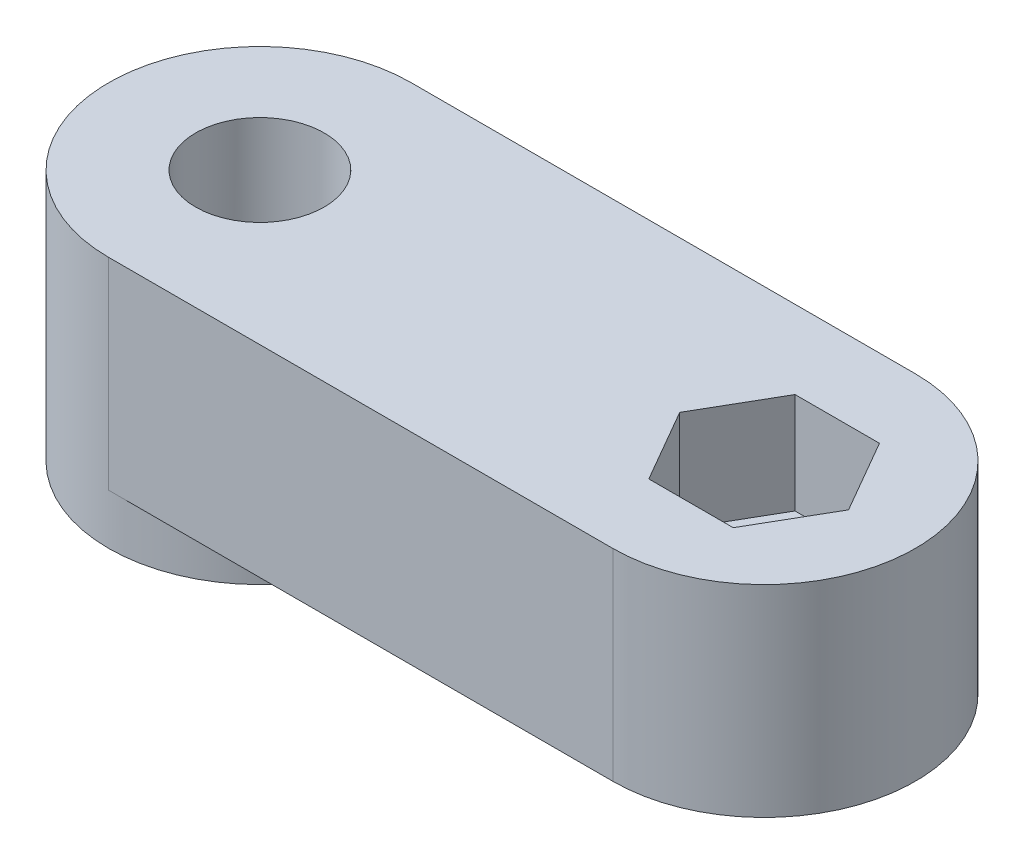
ISO-10303-21;
HEADER;
FILE_DESCRIPTION(('STEP AP214'),'2;1');
FILE_NAME('part.step','',(''),(''),'','','');
FILE_SCHEMA(('AUTOMOTIVE_DESIGN { 1 0 10303 214 1 1 1 1 }'));
ENDSEC;
DATA;
#1=APPLICATION_CONTEXT('core data for automotive mechanical design processes');
#2=APPLICATION_PROTOCOL_DEFINITION('international standard','automotive_design',2000,#1);
#3=PRODUCT_CONTEXT('',#1,'mechanical');
#4=PRODUCT('Part','Part','',(#3));
#5=PRODUCT_RELATED_PRODUCT_CATEGORY('part','',(#4));
#6=PRODUCT_DEFINITION_FORMATION('','',#4);
#7=PRODUCT_DEFINITION_CONTEXT('part definition',#1,'design');
#8=PRODUCT_DEFINITION('design','',#6,#7);
#9=PRODUCT_DEFINITION_SHAPE('','',#8);
#10=(LENGTH_UNIT() NAMED_UNIT(*) SI_UNIT(.MILLI.,.METRE.));
#11=(NAMED_UNIT(*) PLANE_ANGLE_UNIT() SI_UNIT($,.RADIAN.));
#12=(NAMED_UNIT(*) SI_UNIT($,.STERADIAN.) SOLID_ANGLE_UNIT());
#13=UNCERTAINTY_MEASURE_WITH_UNIT(LENGTH_MEASURE(1.E-05),#10,'distance_accuracy_value','');
#14=(GEOMETRIC_REPRESENTATION_CONTEXT(3) GLOBAL_UNCERTAINTY_ASSIGNED_CONTEXT((#13)) GLOBAL_UNIT_ASSIGNED_CONTEXT((#10,
#11,#12)) REPRESENTATION_CONTEXT('',''));
#15=CARTESIAN_POINT('',(0.,0.,0.));
#16=DIRECTION('',(0.,0.,1.));
#17=DIRECTION('',(1.,0.,0.));
#18=AXIS2_PLACEMENT_3D('',#15,#16,#17);
#19=CARTESIAN_POINT('',(20.,10.,0.));
#20=DIRECTION('',(0.,1.,0.));
#21=DIRECTION('',(0.,0.,1.));
#22=AXIS2_PLACEMENT_3D('',#19,#20,#21);
#23=CYLINDRICAL_SURFACE('',#22,2.5);
#24=CARTESIAN_POINT('',(20.,5.,0.));
#25=DIRECTION('',(0.,1.,0.));
#26=DIRECTION('',(0.,0.,1.));
#27=AXIS2_PLACEMENT_3D('',#24,#25,#26);
#28=CIRCLE('',#27,2.5);
#29=CARTESIAN_POINT('',(20.,5.,2.5));
#30=VERTEX_POINT('',#29);
#31=EDGE_CURVE('E267',#30,#30,#28,.T.);
#32=ORIENTED_EDGE('',*,*,#31,.F.);
#33=EDGE_LOOP('',(#32));
#34=FACE_BOUND('',#33,.T.);
#35=CARTESIAN_POINT('',(20.,6.,0.));
#36=DIRECTION('',(0.,1.,0.));
#37=DIRECTION('',(0.,0.,1.));
#38=AXIS2_PLACEMENT_3D('',#35,#36,#37);
#39=CIRCLE('',#38,2.5);
#40=CARTESIAN_POINT('',(20.,6.,2.5));
#41=VERTEX_POINT('',#40);
#42=EDGE_CURVE('E39',#41,#41,#39,.F.);
#43=ORIENTED_EDGE('',*,*,#42,.F.);
#44=EDGE_LOOP('',(#43));
#45=FACE_BOUND('',#44,.T.);
#46=ADVANCED_FACE('F35',(#34,#45),#23,.F.);
#47=CARTESIAN_POINT('',(0.,10.,6.));
#48=DIRECTION('',(0.,0.,-1.));
#49=DIRECTION('',(-1.,0.,0.));
#50=AXIS2_PLACEMENT_3D('',#47,#48,#49);
#51=PLANE('',#50);
#52=DIRECTION('',(-1.,0.,0.));
#53=VECTOR('',#52,1.);
#54=CARTESIAN_POINT('',(0.,2.,6.));
#55=LINE('',#54,#53);
#56=CARTESIAN_POINT('',(20.,2.,6.));
#57=VERTEX_POINT('',#56);
#58=CARTESIAN_POINT('',(0.,2.,6.));
#59=VERTEX_POINT('',#58);
#60=EDGE_CURVE('E213',#57,#59,#55,.T.);
#61=ORIENTED_EDGE('',*,*,#60,.F.);
#62=DIRECTION('',(0.,-1.,0.));
#63=VECTOR('',#62,1.);
#64=CARTESIAN_POINT('',(20.,10.,6.));
#65=LINE('',#64,#63);
#66=CARTESIAN_POINT('',(20.,10.,6.));
#67=VERTEX_POINT('',#66);
#68=EDGE_CURVE('E44',#67,#57,#65,.T.);
#69=ORIENTED_EDGE('',*,*,#68,.F.);
#70=DIRECTION('',(1.,0.,0.));
#71=VECTOR('',#70,1.);
#72=CARTESIAN_POINT('',(0.,10.,6.));
#73=LINE('',#72,#71);
#74=CARTESIAN_POINT('',(0.,10.,6.));
#75=VERTEX_POINT('',#74);
#76=EDGE_CURVE('E277',#75,#67,#73,.T.);
#77=ORIENTED_EDGE('',*,*,#76,.F.);
#78=DIRECTION('',(0.,-1.,0.));
#79=VECTOR('',#78,1.);
#80=CARTESIAN_POINT('',(0.,10.,6.));
#81=LINE('',#80,#79);
#82=EDGE_CURVE('E11',#75,#59,#81,.T.);
#83=ORIENTED_EDGE('',*,*,#82,.T.);
#84=EDGE_LOOP('',(#61,#69,#77,#83));
#85=FACE_BOUND('',#84,.T.);
#86=ADVANCED_FACE('F315',(#85),#51,.F.);
#87=CARTESIAN_POINT('',(20.,10.,0.));
#88=DIRECTION('',(0.,-1.,0.));
#89=DIRECTION('',(0.,0.,-1.));
#90=AXIS2_PLACEMENT_3D('',#87,#88,#89);
#91=CYLINDRICAL_SURFACE('',#90,6.);
#92=CARTESIAN_POINT('',(20.,2.,0.));
#93=DIRECTION('',(0.,-1.,0.));
#94=DIRECTION('',(0.,0.,-1.));
#95=AXIS2_PLACEMENT_3D('',#92,#93,#94);
#96=CIRCLE('',#95,6.);
#97=CARTESIAN_POINT('',(20.,2.,-6.));
#98=VERTEX_POINT('',#97);
#99=EDGE_CURVE('E211',#98,#57,#96,.T.);
#100=ORIENTED_EDGE('',*,*,#99,.F.);
#101=DIRECTION('',(0.,-1.,0.));
#102=VECTOR('',#101,1.);
#103=CARTESIAN_POINT('',(20.,10.,-6.));
#104=LINE('',#103,#102);
#105=CARTESIAN_POINT('',(20.,10.,-6.));
#106=VERTEX_POINT('',#105);
#107=EDGE_CURVE('E288',#106,#98,#104,.T.);
#108=ORIENTED_EDGE('',*,*,#107,.F.);
#109=CARTESIAN_POINT('',(20.,10.,0.));
#110=DIRECTION('',(0.,1.,0.));
#111=DIRECTION('',(0.,0.,1.));
#112=AXIS2_PLACEMENT_3D('',#109,#110,#111);
#113=CIRCLE('',#112,6.);
#114=EDGE_CURVE('E279',#67,#106,#113,.T.);
#115=ORIENTED_EDGE('',*,*,#114,.F.);
#116=ORIENTED_EDGE('',*,*,#68,.T.);
#117=EDGE_LOOP('',(#100,#108,#115,#116));
#118=FACE_BOUND('',#117,.T.);
#119=ADVANCED_FACE('F323',(#118),#91,.T.);
#120=CARTESIAN_POINT('',(0.,10.,-6.));
#121=DIRECTION('',(0.,0.,1.));
#122=DIRECTION('',(1.,0.,0.));
#123=AXIS2_PLACEMENT_3D('',#120,#121,#122);
#124=PLANE('',#123);
#125=DIRECTION('',(1.,0.,0.));
#126=VECTOR('',#125,1.);
#127=CARTESIAN_POINT('',(0.,2.,-6.));
#128=LINE('',#127,#126);
#129=CARTESIAN_POINT('',(0.,2.,-6.));
#130=VERTEX_POINT('',#129);
#131=EDGE_CURVE('E209',#130,#98,#128,.T.);
#132=ORIENTED_EDGE('',*,*,#131,.F.);
#133=DIRECTION('',(0.,-1.,0.));
#134=VECTOR('',#133,1.);
#135=CARTESIAN_POINT('',(0.,10.,-6.));
#136=LINE('',#135,#134);
#137=CARTESIAN_POINT('',(0.,10.,-6.));
#138=VERTEX_POINT('',#137);
#139=EDGE_CURVE('E283',#138,#130,#136,.T.);
#140=ORIENTED_EDGE('',*,*,#139,.F.);
#141=DIRECTION('',(-1.,0.,0.));
#142=VECTOR('',#141,1.);
#143=CARTESIAN_POINT('',(0.,10.,-6.));
#144=LINE('',#143,#142);
#145=EDGE_CURVE('E281',#106,#138,#144,.T.);
#146=ORIENTED_EDGE('',*,*,#145,.F.);
#147=ORIENTED_EDGE('',*,*,#107,.T.);
#148=EDGE_LOOP('',(#132,#140,#146,#147));
#149=FACE_BOUND('',#148,.T.);
#150=ADVANCED_FACE('F309',(#149),#124,.F.);
#151=CARTESIAN_POINT('',(0.,0.,0.));
#152=DIRECTION('',(0.,1.,0.));
#153=DIRECTION('',(0.,0.,1.));
#154=AXIS2_PLACEMENT_3D('',#151,#152,#153);
#155=PLANE('',#154);
#156=DIRECTION('',(0.5,0.,-0.866025403784439));
#157=VECTOR('',#156,1.);
#158=CARTESIAN_POINT('',(-4.21465696508427,0.,0.));
#159=LINE('',#158,#157);
#160=CARTESIAN_POINT('',(-4.21465696508427,0.,0.));
#161=VERTEX_POINT('',#160);
#162=CARTESIAN_POINT('',(-2.10732848254214,0.,-3.65));
#163=VERTEX_POINT('',#162);
#164=EDGE_CURVE('E236',#161,#163,#159,.T.);
#165=ORIENTED_EDGE('',*,*,#164,.F.);
#166=DIRECTION('',(-0.5,0.,-0.866025403784438));
#167=VECTOR('',#166,1.);
#168=CARTESIAN_POINT('',(-2.10732848254213,0.,3.65));
#169=LINE('',#168,#167);
#170=CARTESIAN_POINT('',(-2.10732848254213,0.,3.65));
#171=VERTEX_POINT('',#170);
#172=EDGE_CURVE('E60',#171,#161,#169,.T.);
#173=ORIENTED_EDGE('',*,*,#172,.F.);
#174=DIRECTION('',(-1.,0.,0.));
#175=VECTOR('',#174,1.);
#176=CARTESIAN_POINT('',(2.10732848254214,0.,3.65));
#177=LINE('',#176,#175);
#178=CARTESIAN_POINT('',(2.10732848254214,0.,3.65));
#179=VERTEX_POINT('',#178);
#180=EDGE_CURVE('E219',#179,#171,#177,.T.);
#181=ORIENTED_EDGE('',*,*,#180,.F.);
#182=DIRECTION('',(-0.5,0.,0.866025403784439));
#183=VECTOR('',#182,1.);
#184=CARTESIAN_POINT('',(4.21465696508427,0.,0.));
#185=LINE('',#184,#183);
#186=CARTESIAN_POINT('',(4.21465696508427,0.,0.));
#187=VERTEX_POINT('',#186);
#188=EDGE_CURVE('E245',#187,#179,#185,.T.);
#189=ORIENTED_EDGE('',*,*,#188,.F.);
#190=DIRECTION('',(0.5,0.,0.866025403784439));
#191=VECTOR('',#190,1.);
#192=CARTESIAN_POINT('',(2.10732848254213,0.,-3.65));
#193=LINE('',#192,#191);
#194=CARTESIAN_POINT('',(2.10732848254213,0.,-3.65));
#195=VERTEX_POINT('',#194);
#196=EDGE_CURVE('E242',#195,#187,#193,.T.);
#197=ORIENTED_EDGE('',*,*,#196,.F.);
#198=DIRECTION('',(1.,0.,0.));
#199=VECTOR('',#198,1.);
#200=CARTESIAN_POINT('',(-2.10732848254214,0.,-3.65));
#201=LINE('',#200,#199);
#202=EDGE_CURVE('E239',#163,#195,#201,.T.);
#203=ORIENTED_EDGE('',*,*,#202,.F.);
#204=EDGE_LOOP('',(#165,#173,#181,#189,#197,#203));
#205=FACE_BOUND('',#204,.T.);
#206=CARTESIAN_POINT('',(0.,0.,0.));
#207=DIRECTION('',(0.,1.,0.));
#208=DIRECTION('',(0.,0.,1.));
#209=AXIS2_PLACEMENT_3D('',#206,#207,#208);
#210=CIRCLE('',#209,6.);
#211=CARTESIAN_POINT('',(0.,0.,6.));
#212=VERTEX_POINT('',#211);
#213=EDGE_CURVE('E273',#212,#212,#210,.T.);
#214=ORIENTED_EDGE('',*,*,#213,.F.);
#215=EDGE_LOOP('',(#214));
#216=FACE_BOUND('',#215,.T.);
#217=ADVANCED_FACE('F300',(#205,#216),#155,.F.);
#218=CARTESIAN_POINT('',(20.,10.,0.));
#219=DIRECTION('',(0.,1.,0.));
#220=DIRECTION('',(0.,0.,1.));
#221=AXIS2_PLACEMENT_3D('',#218,#219,#220);
#222=CYLINDRICAL_SURFACE('',#221,2.075);
#223=CARTESIAN_POINT('',(20.,5.,0.));
#224=DIRECTION('',(0.,1.,0.));
#225=DIRECTION('',(0.,0.,1.));
#226=AXIS2_PLACEMENT_3D('',#223,#224,#225);
#227=CIRCLE('',#226,2.075);
#228=CARTESIAN_POINT('',(20.,5.,2.075));
#229=VERTEX_POINT('',#228);
#230=EDGE_CURVE('E264',#229,#229,#227,.T.);
#231=ORIENTED_EDGE('',*,*,#230,.T.);
#232=EDGE_LOOP('',(#231));
#233=FACE_BOUND('',#232,.T.);
#234=CARTESIAN_POINT('',(20.,2.,0.));
#235=DIRECTION('',(0.,-1.,0.));
#236=DIRECTION('',(0.,0.,-1.));
#237=AXIS2_PLACEMENT_3D('',#234,#235,#236);
#238=CIRCLE('',#237,2.075);
#239=CARTESIAN_POINT('',(20.,2.,-2.075));
#240=VERTEX_POINT('',#239);
#241=EDGE_CURVE('E208',#240,#240,#238,.F.);
#242=ORIENTED_EDGE('',*,*,#241,.F.);
#243=EDGE_LOOP('',(#242));
#244=FACE_BOUND('',#243,.T.);
#245=ADVANCED_FACE('F298',(#233,#244),#222,.F.);
#246=CARTESIAN_POINT('',(0.,10.,0.));
#247=DIRECTION('',(0.,-1.,0.));
#248=DIRECTION('',(0.,0.,-1.));
#249=AXIS2_PLACEMENT_3D('',#246,#247,#248);
#250=CYLINDRICAL_SURFACE('',#249,6.);
#251=ORIENTED_EDGE('',*,*,#213,.T.);
#252=EDGE_LOOP('',(#251));
#253=FACE_BOUND('',#252,.T.);
#254=CARTESIAN_POINT('',(0.,2.,0.));
#255=DIRECTION('',(0.,-1.,0.));
#256=DIRECTION('',(0.,0.,-1.));
#257=AXIS2_PLACEMENT_3D('',#254,#255,#256);
#258=CIRCLE('',#257,6.);
#259=EDGE_CURVE('E205',#130,#59,#258,.T.);
#260=ORIENTED_EDGE('',*,*,#259,.T.);
#261=ORIENTED_EDGE('',*,*,#82,.F.);
#262=CARTESIAN_POINT('',(0.,10.,0.));
#263=DIRECTION('',(0.,1.,0.));
#264=DIRECTION('',(0.,0.,1.));
#265=AXIS2_PLACEMENT_3D('',#262,#263,#264);
#266=CIRCLE('',#265,6.);
#267=EDGE_CURVE('E274',#138,#75,#266,.T.);
#268=ORIENTED_EDGE('',*,*,#267,.F.);
#269=ORIENTED_EDGE('',*,*,#139,.T.);
#270=EDGE_LOOP('',(#260,#261,#268,#269));
#271=FACE_BOUND('',#270,.T.);
#272=ADVANCED_FACE('F37',(#253,#271),#250,.T.);
#273=CARTESIAN_POINT('',(0.,10.,0.));
#274=DIRECTION('',(0.,1.,0.));
#275=DIRECTION('',(0.,0.,1.));
#276=AXIS2_PLACEMENT_3D('',#273,#274,#275);
#277=PLANE('',#276);
#278=DIRECTION('',(-1.,0.,0.));
#279=VECTOR('',#278,1.);
#280=CARTESIAN_POINT('',(21.6743157806499,10.,-2.89999999999999));
#281=LINE('',#280,#279);
#282=CARTESIAN_POINT('',(21.6743157806499,10.,-2.89999999999999));
#283=VERTEX_POINT('',#282);
#284=CARTESIAN_POINT('',(18.3256842193501,10.,-2.89999999999999));
#285=VERTEX_POINT('',#284);
#286=EDGE_CURVE('E52',#283,#285,#281,.T.);
#287=ORIENTED_EDGE('',*,*,#286,.F.);
#288=DIRECTION('',(-0.5,0.,-0.866025403784439));
#289=VECTOR('',#288,1.);
#290=CARTESIAN_POINT('',(23.3486315612998,10.,0.));
#291=LINE('',#290,#289);
#292=CARTESIAN_POINT('',(23.3486315612998,10.,0.));
#293=VERTEX_POINT('',#292);
#294=EDGE_CURVE('E172',#293,#283,#291,.T.);
#295=ORIENTED_EDGE('',*,*,#294,.F.);
#296=DIRECTION('',(0.5,0.,-0.866025403784439));
#297=VECTOR('',#296,1.);
#298=CARTESIAN_POINT('',(21.6743157806499,10.,2.90000000000001));
#299=LINE('',#298,#297);
#300=CARTESIAN_POINT('',(21.6743157806499,10.,2.90000000000001));
#301=VERTEX_POINT('',#300);
#302=EDGE_CURVE('E175',#301,#293,#299,.T.);
#303=ORIENTED_EDGE('',*,*,#302,.F.);
#304=DIRECTION('',(1.,0.,0.));
#305=VECTOR('',#304,1.);
#306=CARTESIAN_POINT('',(18.3256842193501,10.,2.90000000000001));
#307=LINE('',#306,#305);
#308=CARTESIAN_POINT('',(18.3256842193501,10.,2.90000000000001));
#309=VERTEX_POINT('',#308);
#310=EDGE_CURVE('E191',#309,#301,#307,.T.);
#311=ORIENTED_EDGE('',*,*,#310,.F.);
#312=DIRECTION('',(0.5,0.,0.866025403784438));
#313=VECTOR('',#312,1.);
#314=CARTESIAN_POINT('',(16.6513684387002,10.,0.));
#315=LINE('',#314,#313);
#316=CARTESIAN_POINT('',(16.6513684387002,10.,0.));
#317=VERTEX_POINT('',#316);
#318=EDGE_CURVE('E188',#317,#309,#315,.T.);
#319=ORIENTED_EDGE('',*,*,#318,.F.);
#320=DIRECTION('',(-0.5,0.,0.866025403784439));
#321=VECTOR('',#320,1.);
#322=CARTESIAN_POINT('',(18.3256842193501,10.,-2.89999999999999));
#323=LINE('',#322,#321);
#324=EDGE_CURVE('E186',#285,#317,#323,.T.);
#325=ORIENTED_EDGE('',*,*,#324,.F.);
#326=EDGE_LOOP('',(#287,#295,#303,#311,#319,#325));
#327=FACE_BOUND('',#326,.T.);
#328=CARTESIAN_POINT('',(0.,10.,0.));
#329=DIRECTION('',(0.,1.,0.));
#330=DIRECTION('',(0.,0.,1.));
#331=AXIS2_PLACEMENT_3D('',#328,#329,#330);
#332=CIRCLE('',#331,2.55);
#333=CARTESIAN_POINT('',(0.,10.,2.55));
#334=VERTEX_POINT('',#333);
#335=EDGE_CURVE('E270',#334,#334,#332,.T.);
#336=ORIENTED_EDGE('',*,*,#335,.F.);
#337=EDGE_LOOP('',(#336));
#338=FACE_BOUND('',#337,.T.);
#339=ORIENTED_EDGE('',*,*,#267,.T.);
#340=ORIENTED_EDGE('',*,*,#76,.T.);
#341=ORIENTED_EDGE('',*,*,#114,.T.);
#342=ORIENTED_EDGE('',*,*,#145,.T.);
#343=EDGE_LOOP('',(#339,#340,#341,#342));
#344=FACE_BOUND('',#343,.T.);
#345=ADVANCED_FACE('F307',(#327,#338,#344),#277,.T.);
#346=CARTESIAN_POINT('',(0.,10.,0.));
#347=DIRECTION('',(0.,1.,0.));
#348=DIRECTION('',(0.,0.,1.));
#349=AXIS2_PLACEMENT_3D('',#346,#347,#348);
#350=CYLINDRICAL_SURFACE('',#349,2.55);
#351=CARTESIAN_POINT('',(0.,5.,0.));
#352=DIRECTION('',(0.,-1.,0.));
#353=DIRECTION('',(0.,0.,-1.));
#354=AXIS2_PLACEMENT_3D('',#351,#352,#353);
#355=CIRCLE('',#354,2.55);
#356=CARTESIAN_POINT('',(0.,5.,-2.55));
#357=VERTEX_POINT('',#356);
#358=EDGE_CURVE('E252',#357,#357,#355,.F.);
#359=ORIENTED_EDGE('',*,*,#358,.F.);
#360=EDGE_LOOP('',(#359));
#361=FACE_BOUND('',#360,.T.);
#362=ORIENTED_EDGE('',*,*,#335,.T.);
#363=EDGE_LOOP('',(#362));
#364=FACE_BOUND('',#363,.T.);
#365=ADVANCED_FACE('F329',(#361,#364),#350,.F.);
#366=CARTESIAN_POINT('',(17.5,5.,0.));
#367=DIRECTION('',(0.,-1.,0.));
#368=DIRECTION('',(0.,0.,-1.));
#369=AXIS2_PLACEMENT_3D('',#366,#367,#368);
#370=PLANE('',#369);
#371=ORIENTED_EDGE('',*,*,#230,.F.);
#372=EDGE_LOOP('',(#371));
#373=FACE_BOUND('',#372,.T.);
#374=ORIENTED_EDGE('',*,*,#31,.T.);
#375=EDGE_LOOP('',(#374));
#376=FACE_BOUND('',#375,.T.);
#377=ADVANCED_FACE('F328',(#373,#376),#370,.F.);
#378=CARTESIAN_POINT('',(0.,5.,0.));
#379=DIRECTION('',(0.,-1.,0.));
#380=DIRECTION('',(0.,0.,-1.));
#381=AXIS2_PLACEMENT_3D('',#378,#379,#380);
#382=PLANE('',#381);
#383=DIRECTION('',(-0.5,0.,-0.866025403784438));
#384=VECTOR('',#383,1.);
#385=CARTESIAN_POINT('',(-2.10732848254213,5.,3.65));
#386=LINE('',#385,#384);
#387=CARTESIAN_POINT('',(-2.10732848254213,5.,3.65));
#388=VERTEX_POINT('',#387);
#389=CARTESIAN_POINT('',(-4.21465696508427,5.,0.));
#390=VERTEX_POINT('',#389);
#391=EDGE_CURVE('E215',#388,#390,#386,.T.);
#392=ORIENTED_EDGE('',*,*,#391,.T.);
#393=DIRECTION('',(0.5,0.,-0.866025403784439));
#394=VECTOR('',#393,1.);
#395=CARTESIAN_POINT('',(-4.21465696508427,5.,0.));
#396=LINE('',#395,#394);
#397=CARTESIAN_POINT('',(-2.10732848254214,5.,-3.65));
#398=VERTEX_POINT('',#397);
#399=EDGE_CURVE('E218',#390,#398,#396,.T.);
#400=ORIENTED_EDGE('',*,*,#399,.T.);
#401=DIRECTION('',(1.,0.,0.));
#402=VECTOR('',#401,1.);
#403=CARTESIAN_POINT('',(-2.10732848254214,5.,-3.65));
#404=LINE('',#403,#402);
#405=CARTESIAN_POINT('',(2.10732848254213,5.,-3.65));
#406=VERTEX_POINT('',#405);
#407=EDGE_CURVE('E222',#398,#406,#404,.T.);
#408=ORIENTED_EDGE('',*,*,#407,.T.);
#409=DIRECTION('',(0.5,0.,0.866025403784439));
#410=VECTOR('',#409,1.);
#411=CARTESIAN_POINT('',(2.10732848254213,5.,-3.65));
#412=LINE('',#411,#410);
#413=CARTESIAN_POINT('',(4.21465696508427,5.,0.));
#414=VERTEX_POINT('',#413);
#415=EDGE_CURVE('E225',#406,#414,#412,.T.);
#416=ORIENTED_EDGE('',*,*,#415,.T.);
#417=DIRECTION('',(-0.5,0.,0.866025403784439));
#418=VECTOR('',#417,1.);
#419=CARTESIAN_POINT('',(4.21465696508427,5.,0.));
#420=LINE('',#419,#418);
#421=CARTESIAN_POINT('',(2.10732848254214,5.,3.65));
#422=VERTEX_POINT('',#421);
#423=EDGE_CURVE('E228',#414,#422,#420,.T.);
#424=ORIENTED_EDGE('',*,*,#423,.T.);
#425=DIRECTION('',(-1.,0.,0.));
#426=VECTOR('',#425,1.);
#427=CARTESIAN_POINT('',(2.10732848254214,5.,3.65));
#428=LINE('',#427,#426);
#429=EDGE_CURVE('E231',#422,#388,#428,.T.);
#430=ORIENTED_EDGE('',*,*,#429,.T.);
#431=EDGE_LOOP('',(#392,#400,#408,#416,#424,#430));
#432=FACE_BOUND('',#431,.T.);
#433=ORIENTED_EDGE('',*,*,#358,.T.);
#434=EDGE_LOOP('',(#433));
#435=FACE_BOUND('',#434,.T.);
#436=ADVANCED_FACE('F368',(#432,#435),#382,.T.);
#437=CARTESIAN_POINT('',(-2.10732848254213,5.,3.65));
#438=DIRECTION('',(-0.866025403784438,0.,0.5));
#439=DIRECTION('',(0.5,0.,0.866025403784439));
#440=AXIS2_PLACEMENT_3D('',#437,#438,#439);
#441=PLANE('',#440);
#442=ORIENTED_EDGE('',*,*,#172,.T.);
#443=DIRECTION('',(0.,-1.,0.));
#444=VECTOR('',#443,1.);
#445=CARTESIAN_POINT('',(-4.21465696508427,5.,0.));
#446=LINE('',#445,#444);
#447=EDGE_CURVE('E234',#390,#161,#446,.T.);
#448=ORIENTED_EDGE('',*,*,#447,.F.);
#449=ORIENTED_EDGE('',*,*,#391,.F.);
#450=DIRECTION('',(0.,-1.,0.));
#451=VECTOR('',#450,1.);
#452=CARTESIAN_POINT('',(-2.10732848254213,5.,3.65));
#453=LINE('',#452,#451);
#454=EDGE_CURVE('E250',#388,#171,#453,.T.);
#455=ORIENTED_EDGE('',*,*,#454,.T.);
#456=EDGE_LOOP('',(#442,#448,#449,#455));
#457=FACE_BOUND('',#456,.T.);
#458=ADVANCED_FACE('F371',(#457),#441,.F.);
#459=CARTESIAN_POINT('',(2.10732848254214,5.,3.65));
#460=DIRECTION('',(0.,0.,1.));
#461=DIRECTION('',(1.,0.,0.));
#462=AXIS2_PLACEMENT_3D('',#459,#460,#461);
#463=PLANE('',#462);
#464=ORIENTED_EDGE('',*,*,#180,.T.);
#465=ORIENTED_EDGE('',*,*,#454,.F.);
#466=ORIENTED_EDGE('',*,*,#429,.F.);
#467=DIRECTION('',(0.,-1.,0.));
#468=VECTOR('',#467,1.);
#469=CARTESIAN_POINT('',(2.10732848254214,5.,3.65));
#470=LINE('',#469,#468);
#471=EDGE_CURVE('E253',#422,#179,#470,.T.);
#472=ORIENTED_EDGE('',*,*,#471,.T.);
#473=EDGE_LOOP('',(#464,#465,#466,#472));
#474=FACE_BOUND('',#473,.T.);
#475=ADVANCED_FACE('F373',(#474),#463,.F.);
#476=CARTESIAN_POINT('',(4.21465696508427,5.,0.));
#477=DIRECTION('',(0.866025403784439,0.,0.5));
#478=DIRECTION('',(0.5,0.,-0.866025403784439));
#479=AXIS2_PLACEMENT_3D('',#476,#477,#478);
#480=PLANE('',#479);
#481=ORIENTED_EDGE('',*,*,#188,.T.);
#482=ORIENTED_EDGE('',*,*,#471,.F.);
#483=ORIENTED_EDGE('',*,*,#423,.F.);
#484=DIRECTION('',(0.,-1.,0.));
#485=VECTOR('',#484,1.);
#486=CARTESIAN_POINT('',(4.21465696508427,5.,0.));
#487=LINE('',#486,#485);
#488=EDGE_CURVE('E255',#414,#187,#487,.T.);
#489=ORIENTED_EDGE('',*,*,#488,.T.);
#490=EDGE_LOOP('',(#481,#482,#483,#489));
#491=FACE_BOUND('',#490,.T.);
#492=ADVANCED_FACE('F376',(#491),#480,.F.);
#493=CARTESIAN_POINT('',(2.10732848254213,5.,-3.65));
#494=DIRECTION('',(0.866025403784439,0.,-0.5));
#495=DIRECTION('',(-0.5,0.,-0.866025403784439));
#496=AXIS2_PLACEMENT_3D('',#493,#494,#495);
#497=PLANE('',#496);
#498=ORIENTED_EDGE('',*,*,#196,.T.);
#499=ORIENTED_EDGE('',*,*,#488,.F.);
#500=ORIENTED_EDGE('',*,*,#415,.F.);
#501=DIRECTION('',(0.,-1.,0.));
#502=VECTOR('',#501,1.);
#503=CARTESIAN_POINT('',(2.10732848254213,5.,-3.65));
#504=LINE('',#503,#502);
#505=EDGE_CURVE('E257',#406,#195,#504,.T.);
#506=ORIENTED_EDGE('',*,*,#505,.T.);
#507=EDGE_LOOP('',(#498,#499,#500,#506));
#508=FACE_BOUND('',#507,.T.);
#509=ADVANCED_FACE('F380',(#508),#497,.F.);
#510=CARTESIAN_POINT('',(-2.10732848254214,5.,-3.65));
#511=DIRECTION('',(0.,0.,-1.));
#512=DIRECTION('',(-1.,0.,0.));
#513=AXIS2_PLACEMENT_3D('',#510,#511,#512);
#514=PLANE('',#513);
#515=ORIENTED_EDGE('',*,*,#202,.T.);
#516=ORIENTED_EDGE('',*,*,#505,.F.);
#517=ORIENTED_EDGE('',*,*,#407,.F.);
#518=DIRECTION('',(0.,-1.,0.));
#519=VECTOR('',#518,1.);
#520=CARTESIAN_POINT('',(-2.10732848254214,5.,-3.65));
#521=LINE('',#520,#519);
#522=EDGE_CURVE('E259',#398,#163,#521,.T.);
#523=ORIENTED_EDGE('',*,*,#522,.T.);
#524=EDGE_LOOP('',(#515,#516,#517,#523));
#525=FACE_BOUND('',#524,.T.);
#526=ADVANCED_FACE('F362',(#525),#514,.F.);
#527=CARTESIAN_POINT('',(-4.21465696508427,5.,0.));
#528=DIRECTION('',(-0.866025403784439,0.,-0.5));
#529=DIRECTION('',(-0.5,0.,0.866025403784439));
#530=AXIS2_PLACEMENT_3D('',#527,#528,#529);
#531=PLANE('',#530);
#532=ORIENTED_EDGE('',*,*,#164,.T.);
#533=ORIENTED_EDGE('',*,*,#522,.F.);
#534=ORIENTED_EDGE('',*,*,#399,.F.);
#535=ORIENTED_EDGE('',*,*,#447,.T.);
#536=EDGE_LOOP('',(#532,#533,#534,#535));
#537=FACE_BOUND('',#536,.T.);
#538=ADVANCED_FACE('F355',(#537),#531,.F.);
#539=CARTESIAN_POINT('',(0.,2.,0.));
#540=DIRECTION('',(0.,-1.,0.));
#541=DIRECTION('',(0.,0.,-1.));
#542=AXIS2_PLACEMENT_3D('',#539,#540,#541);
#543=PLANE('',#542);
#544=ORIENTED_EDGE('',*,*,#241,.T.);
#545=EDGE_LOOP('',(#544));
#546=FACE_BOUND('',#545,.T.);
#547=ORIENTED_EDGE('',*,*,#60,.T.);
#548=ORIENTED_EDGE('',*,*,#259,.F.);
#549=ORIENTED_EDGE('',*,*,#131,.T.);
#550=ORIENTED_EDGE('',*,*,#99,.T.);
#551=EDGE_LOOP('',(#547,#548,#549,#550));
#552=FACE_BOUND('',#551,.T.);
#553=ADVANCED_FACE('F295',(#546,#552),#543,.T.);
#554=CARTESIAN_POINT('',(0.,6.,0.));
#555=DIRECTION('',(0.,1.,0.));
#556=DIRECTION('',(0.,0.,1.));
#557=AXIS2_PLACEMENT_3D('',#554,#555,#556);
#558=PLANE('',#557);
#559=DIRECTION('',(-1.,0.,0.));
#560=VECTOR('',#559,1.);
#561=CARTESIAN_POINT('',(21.6743157806499,6.,-2.89999999999999));
#562=LINE('',#561,#560);
#563=CARTESIAN_POINT('',(21.6743157806499,6.,-2.89999999999999));
#564=VERTEX_POINT('',#563);
#565=CARTESIAN_POINT('',(18.3256842193501,6.,-2.89999999999999));
#566=VERTEX_POINT('',#565);
#567=EDGE_CURVE('E152',#564,#566,#562,.T.);
#568=ORIENTED_EDGE('',*,*,#567,.T.);
#569=DIRECTION('',(-0.5,0.,0.866025403784439));
#570=VECTOR('',#569,1.);
#571=CARTESIAN_POINT('',(18.3256842193501,6.,-2.89999999999999));
#572=LINE('',#571,#570);
#573=CARTESIAN_POINT('',(16.6513684387002,6.,0.));
#574=VERTEX_POINT('',#573);
#575=EDGE_CURVE('E161',#566,#574,#572,.T.);
#576=ORIENTED_EDGE('',*,*,#575,.T.);
#577=DIRECTION('',(0.5,0.,0.866025403784438));
#578=VECTOR('',#577,1.);
#579=CARTESIAN_POINT('',(16.6513684387002,6.,0.));
#580=LINE('',#579,#578);
#581=CARTESIAN_POINT('',(18.3256842193501,6.,2.90000000000001));
#582=VERTEX_POINT('',#581);
#583=EDGE_CURVE('E166',#574,#582,#580,.T.);
#584=ORIENTED_EDGE('',*,*,#583,.T.);
#585=DIRECTION('',(1.,0.,0.));
#586=VECTOR('',#585,1.);
#587=CARTESIAN_POINT('',(18.3256842193501,6.,2.90000000000001));
#588=LINE('',#587,#586);
#589=CARTESIAN_POINT('',(21.6743157806499,6.,2.90000000000001));
#590=VERTEX_POINT('',#589);
#591=EDGE_CURVE('E179',#582,#590,#588,.T.);
#592=ORIENTED_EDGE('',*,*,#591,.T.);
#593=DIRECTION('',(0.5,0.,-0.866025403784439));
#594=VECTOR('',#593,1.);
#595=CARTESIAN_POINT('',(21.6743157806499,6.,2.90000000000001));
#596=LINE('',#595,#594);
#597=CARTESIAN_POINT('',(23.3486315612998,6.,0.));
#598=VERTEX_POINT('',#597);
#599=EDGE_CURVE('E182',#590,#598,#596,.T.);
#600=ORIENTED_EDGE('',*,*,#599,.T.);
#601=DIRECTION('',(-0.5,0.,-0.866025403784439));
#602=VECTOR('',#601,1.);
#603=CARTESIAN_POINT('',(23.3486315612998,6.,0.));
#604=LINE('',#603,#602);
#605=EDGE_CURVE('E158',#598,#564,#604,.T.);
#606=ORIENTED_EDGE('',*,*,#605,.T.);
#607=EDGE_LOOP('',(#568,#576,#584,#592,#600,#606));
#608=FACE_BOUND('',#607,.T.);
#609=ORIENTED_EDGE('',*,*,#42,.T.);
#610=EDGE_LOOP('',(#609));
#611=FACE_BOUND('',#610,.T.);
#612=ADVANCED_FACE('F168',(#608,#611),#558,.T.);
#613=CARTESIAN_POINT('',(21.6743157806499,6.,-2.89999999999999));
#614=DIRECTION('',(0.,0.,-1.));
#615=DIRECTION('',(-1.,0.,0.));
#616=AXIS2_PLACEMENT_3D('',#613,#614,#615);
#617=PLANE('',#616);
#618=ORIENTED_EDGE('',*,*,#286,.T.);
#619=DIRECTION('',(0.,1.,0.));
#620=VECTOR('',#619,1.);
#621=CARTESIAN_POINT('',(18.3256842193501,6.,-2.89999999999999));
#622=LINE('',#621,#620);
#623=EDGE_CURVE('E148',#566,#285,#622,.T.);
#624=ORIENTED_EDGE('',*,*,#623,.F.);
#625=ORIENTED_EDGE('',*,*,#567,.F.);
#626=DIRECTION('',(0.,1.,0.));
#627=VECTOR('',#626,1.);
#628=CARTESIAN_POINT('',(21.6743157806499,6.,-2.89999999999999));
#629=LINE('',#628,#627);
#630=EDGE_CURVE('E196',#564,#283,#629,.T.);
#631=ORIENTED_EDGE('',*,*,#630,.T.);
#632=EDGE_LOOP('',(#618,#624,#625,#631));
#633=FACE_BOUND('',#632,.T.);
#634=ADVANCED_FACE('F150',(#633),#617,.F.);
#635=CARTESIAN_POINT('',(23.3486315612998,6.,0.));
#636=DIRECTION('',(0.866025403784439,0.,-0.5));
#637=DIRECTION('',(-0.5,0.,-0.866025403784439));
#638=AXIS2_PLACEMENT_3D('',#635,#636,#637);
#639=PLANE('',#638);
#640=ORIENTED_EDGE('',*,*,#294,.T.);
#641=ORIENTED_EDGE('',*,*,#630,.F.);
#642=ORIENTED_EDGE('',*,*,#605,.F.);
#643=DIRECTION('',(0.,1.,0.));
#644=VECTOR('',#643,1.);
#645=CARTESIAN_POINT('',(23.3486315612998,6.,0.));
#646=LINE('',#645,#644);
#647=EDGE_CURVE('E198',#598,#293,#646,.T.);
#648=ORIENTED_EDGE('',*,*,#647,.T.);
#649=EDGE_LOOP('',(#640,#641,#642,#648));
#650=FACE_BOUND('',#649,.T.);
#651=ADVANCED_FACE('F469',(#650),#639,.F.);
#652=CARTESIAN_POINT('',(21.6743157806499,6.,2.90000000000001));
#653=DIRECTION('',(0.866025403784439,0.,0.5));
#654=DIRECTION('',(0.5,0.,-0.866025403784439));
#655=AXIS2_PLACEMENT_3D('',#652,#653,#654);
#656=PLANE('',#655);
#657=ORIENTED_EDGE('',*,*,#302,.T.);
#658=ORIENTED_EDGE('',*,*,#647,.F.);
#659=ORIENTED_EDGE('',*,*,#599,.F.);
#660=DIRECTION('',(0.,1.,0.));
#661=VECTOR('',#660,1.);
#662=CARTESIAN_POINT('',(21.6743157806499,6.,2.90000000000001));
#663=LINE('',#662,#661);
#664=EDGE_CURVE('E200',#590,#301,#663,.T.);
#665=ORIENTED_EDGE('',*,*,#664,.T.);
#666=EDGE_LOOP('',(#657,#658,#659,#665));
#667=FACE_BOUND('',#666,.T.);
#668=ADVANCED_FACE('F476',(#667),#656,.F.);
#669=CARTESIAN_POINT('',(18.3256842193501,6.,2.90000000000001));
#670=DIRECTION('',(0.,0.,1.));
#671=DIRECTION('',(1.,0.,0.));
#672=AXIS2_PLACEMENT_3D('',#669,#670,#671);
#673=PLANE('',#672);
#674=ORIENTED_EDGE('',*,*,#310,.T.);
#675=ORIENTED_EDGE('',*,*,#664,.F.);
#676=ORIENTED_EDGE('',*,*,#591,.F.);
#677=DIRECTION('',(0.,1.,0.));
#678=VECTOR('',#677,1.);
#679=CARTESIAN_POINT('',(18.3256842193501,6.,2.90000000000001));
#680=LINE('',#679,#678);
#681=EDGE_CURVE('E202',#582,#309,#680,.T.);
#682=ORIENTED_EDGE('',*,*,#681,.T.);
#683=EDGE_LOOP('',(#674,#675,#676,#682));
#684=FACE_BOUND('',#683,.T.);
#685=ADVANCED_FACE('F485',(#684),#673,.F.);
#686=CARTESIAN_POINT('',(16.6513684387002,6.,0.));
#687=DIRECTION('',(-0.866025403784438,0.,0.5));
#688=DIRECTION('',(0.5,0.,0.866025403784438));
#689=AXIS2_PLACEMENT_3D('',#686,#687,#688);
#690=PLANE('',#689);
#691=ORIENTED_EDGE('',*,*,#318,.T.);
#692=ORIENTED_EDGE('',*,*,#681,.F.);
#693=ORIENTED_EDGE('',*,*,#583,.F.);
#694=DIRECTION('',(0.,1.,0.));
#695=VECTOR('',#694,1.);
#696=CARTESIAN_POINT('',(16.6513684387002,6.,0.));
#697=LINE('',#696,#695);
#698=EDGE_CURVE('E157',#574,#317,#697,.T.);
#699=ORIENTED_EDGE('',*,*,#698,.T.);
#700=EDGE_LOOP('',(#691,#692,#693,#699));
#701=FACE_BOUND('',#700,.T.);
#702=ADVANCED_FACE('F494',(#701),#690,.F.);
#703=CARTESIAN_POINT('',(18.3256842193501,6.,-2.89999999999999));
#704=DIRECTION('',(-0.866025403784439,0.,-0.5));
#705=DIRECTION('',(-0.5,0.,0.866025403784439));
#706=AXIS2_PLACEMENT_3D('',#703,#704,#705);
#707=PLANE('',#706);
#708=ORIENTED_EDGE('',*,*,#324,.T.);
#709=ORIENTED_EDGE('',*,*,#698,.F.);
#710=ORIENTED_EDGE('',*,*,#575,.F.);
#711=ORIENTED_EDGE('',*,*,#623,.T.);
#712=EDGE_LOOP('',(#708,#709,#710,#711));
#713=FACE_BOUND('',#712,.T.);
#714=ADVANCED_FACE('F162',(#713),#707,.F.);
#715=CLOSED_SHELL('',(#46,#86,#119,#150,#217,#245,#272,#345,#365,#377,#436,#458,#475,#492,#509,
#526,#538,#553,#612,#634,#651,#668,#685,#702,#714));
#716=MANIFOLD_SOLID_BREP('B2',#715);
#717=ADVANCED_BREP_SHAPE_REPRESENTATION('',(#18,#716),#14);
#718=SHAPE_DEFINITION_REPRESENTATION(#9,#717);
ENDSEC;
END-ISO-10303-21;
